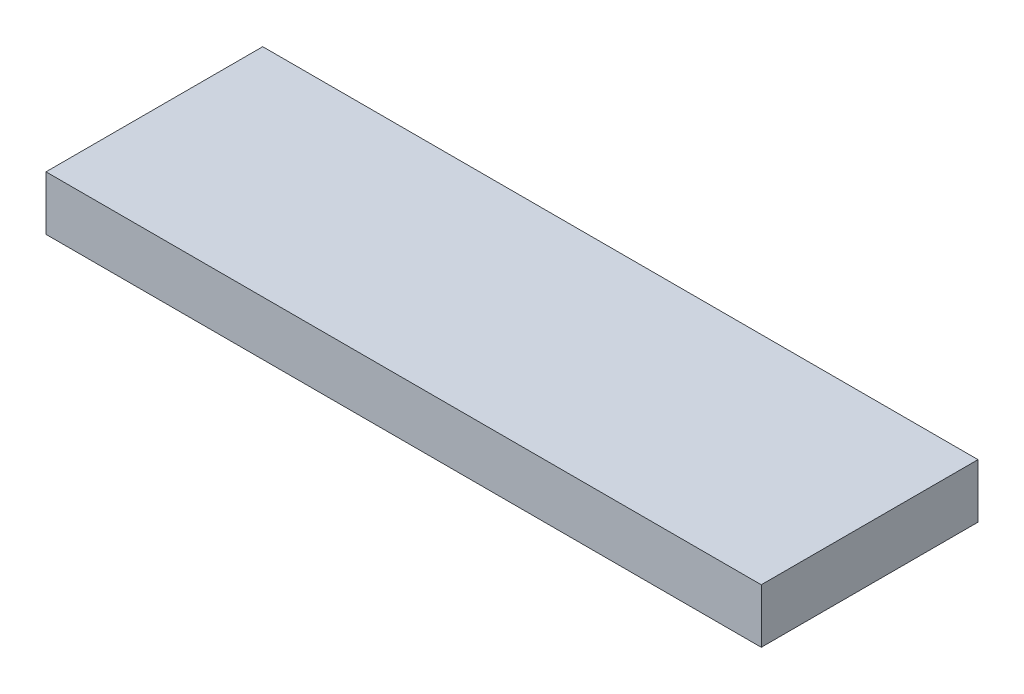
ISO-10303-21;
HEADER;
FILE_DESCRIPTION(('STEP AP214'),'2;1');
FILE_NAME('part.step','',(''),(''),'','','');
FILE_SCHEMA(('AUTOMOTIVE_DESIGN { 1 0 10303 214 1 1 1 1 }'));
ENDSEC;
DATA;
#1=APPLICATION_CONTEXT('core data for automotive mechanical design processes');
#2=APPLICATION_PROTOCOL_DEFINITION('international standard','automotive_design',2000,#1);
#3=PRODUCT_CONTEXT('',#1,'mechanical');
#4=PRODUCT('Part','Part','',(#3));
#5=PRODUCT_RELATED_PRODUCT_CATEGORY('part','',(#4));
#6=PRODUCT_DEFINITION_FORMATION('','',#4);
#7=PRODUCT_DEFINITION_CONTEXT('part definition',#1,'design');
#8=PRODUCT_DEFINITION('design','',#6,#7);
#9=PRODUCT_DEFINITION_SHAPE('','',#8);
#10=(LENGTH_UNIT() NAMED_UNIT(*) SI_UNIT(.MILLI.,.METRE.));
#11=(NAMED_UNIT(*) PLANE_ANGLE_UNIT() SI_UNIT($,.RADIAN.));
#12=(NAMED_UNIT(*) SI_UNIT($,.STERADIAN.) SOLID_ANGLE_UNIT());
#13=UNCERTAINTY_MEASURE_WITH_UNIT(LENGTH_MEASURE(1.E-05),#10,'distance_accuracy_value','');
#14=(GEOMETRIC_REPRESENTATION_CONTEXT(3) GLOBAL_UNCERTAINTY_ASSIGNED_CONTEXT((#13)) GLOBAL_UNIT_ASSIGNED_CONTEXT((#10,
#11,#12)) REPRESENTATION_CONTEXT('',''));
#15=CARTESIAN_POINT('',(0.,0.,0.));
#16=DIRECTION('',(0.,0.,1.));
#17=DIRECTION('',(1.,0.,0.));
#18=AXIS2_PLACEMENT_3D('',#15,#16,#17);
#19=CARTESIAN_POINT('',(0.,0.,0.));
#20=DIRECTION('',(0.,1.,0.));
#21=DIRECTION('',(0.,0.,1.));
#22=AXIS2_PLACEMENT_3D('',#19,#20,#21);
#23=PLANE('',#22);
#24=CARTESIAN_POINT('',(13.3548728060282,0.,0.));
#25=DIRECTION('',(0.,1.,0.));
#26=DIRECTION('',(0.,0.,-1.));
#27=AXIS2_PLACEMENT_3D('',#24,#25,#26);
#28=CIRCLE('',#27,5.08);
#29=CARTESIAN_POINT('',(13.3548728060282,0.,-5.08000000000009));
#30=VERTEX_POINT('',#29);
#31=CARTESIAN_POINT('',(13.3548728060283,0.,5.07999999999991));
#32=VERTEX_POINT('',#31);
#33=EDGE_CURVE('E66',#30,#32,#28,.T.);
#34=ORIENTED_EDGE('',*,*,#33,.T.);
#35=DIRECTION('',(1.,0.,0.));
#36=VECTOR('',#35,1.);
#37=CARTESIAN_POINT('',(13.3548728060283,0.,5.07999999999991));
#38=LINE('',#37,#36);
#39=CARTESIAN_POINT('',(20.9351271939718,0.,5.07999999999986));
#40=VERTEX_POINT('',#39);
#41=EDGE_CURVE('E180',#32,#40,#38,.T.);
#42=ORIENTED_EDGE('',*,*,#41,.T.);
#43=CARTESIAN_POINT('',(20.9351271939718,0.,-1.42796308022528E-13));
#44=DIRECTION('',(0.,1.,0.));
#45=DIRECTION('',(0.,0.,-1.));
#46=AXIS2_PLACEMENT_3D('',#43,#44,#45);
#47=CIRCLE('',#46,5.08);
#48=CARTESIAN_POINT('',(20.9351271939717,0.,-5.08000000000014));
#49=VERTEX_POINT('',#48);
#50=EDGE_CURVE('E176',#40,#49,#47,.T.);
#51=ORIENTED_EDGE('',*,*,#50,.T.);
#52=DIRECTION('',(-1.,0.,0.));
#53=VECTOR('',#52,1.);
#54=CARTESIAN_POINT('',(13.3548728060282,0.,-5.08000000000009));
#55=LINE('',#54,#53);
#56=EDGE_CURVE('E173',#49,#30,#55,.T.);
#57=ORIENTED_EDGE('',*,*,#56,.T.);
#58=EDGE_LOOP('',(#34,#42,#51,#57));
#59=FACE_BOUND('',#58,.T.);
#60=DIRECTION('',(0.,0.,1.));
#61=VECTOR('',#60,1.);
#62=CARTESIAN_POINT('',(-41.91,0.,12.7));
#63=LINE('',#62,#61);
#64=CARTESIAN_POINT('',(-41.91,0.,-12.7));
#65=VERTEX_POINT('',#64);
#66=CARTESIAN_POINT('',(-41.91,0.,12.7));
#67=VERTEX_POINT('',#66);
#68=EDGE_CURVE('E154',#65,#67,#63,.T.);
#69=ORIENTED_EDGE('',*,*,#68,.F.);
#70=DIRECTION('',(-1.,0.,0.));
#71=VECTOR('',#70,1.);
#72=CARTESIAN_POINT('',(41.91,0.,-12.7));
#73=LINE('',#72,#71);
#74=CARTESIAN_POINT('',(41.91,0.,-12.7));
#75=VERTEX_POINT('',#74);
#76=EDGE_CURVE('E195',#75,#65,#73,.T.);
#77=ORIENTED_EDGE('',*,*,#76,.F.);
#78=DIRECTION('',(0.,0.,-1.));
#79=VECTOR('',#78,1.);
#80=CARTESIAN_POINT('',(41.91,0.,12.7));
#81=LINE('',#80,#79);
#82=CARTESIAN_POINT('',(41.91,0.,12.7));
#83=VERTEX_POINT('',#82);
#84=EDGE_CURVE('E203',#83,#75,#81,.T.);
#85=ORIENTED_EDGE('',*,*,#84,.F.);
#86=DIRECTION('',(1.,0.,0.));
#87=VECTOR('',#86,1.);
#88=CARTESIAN_POINT('',(41.91,0.,12.7));
#89=LINE('',#88,#87);
#90=EDGE_CURVE('E158',#67,#83,#89,.T.);
#91=ORIENTED_EDGE('',*,*,#90,.F.);
#92=EDGE_LOOP('',(#69,#77,#85,#91));
#93=FACE_BOUND('',#92,.T.);
#94=CARTESIAN_POINT('',(-13.3548728060282,0.,0.));
#95=DIRECTION('',(0.,1.,0.));
#96=DIRECTION('',(0.,0.,1.));
#97=AXIS2_PLACEMENT_3D('',#94,#95,#96);
#98=CIRCLE('',#97,5.08);
#99=CARTESIAN_POINT('',(-13.3548728060282,0.,5.08));
#100=VERTEX_POINT('',#99);
#101=CARTESIAN_POINT('',(-13.3548728060282,0.,-5.08));
#102=VERTEX_POINT('',#101);
#103=EDGE_CURVE('E58',#100,#102,#98,.T.);
#104=ORIENTED_EDGE('',*,*,#103,.T.);
#105=DIRECTION('',(-1.,0.,0.));
#106=VECTOR('',#105,1.);
#107=CARTESIAN_POINT('',(-13.3548728060282,0.,-5.08));
#108=LINE('',#107,#106);
#109=CARTESIAN_POINT('',(-20.9351271939718,0.,-5.08));
#110=VERTEX_POINT('',#109);
#111=EDGE_CURVE('E153',#102,#110,#108,.T.);
#112=ORIENTED_EDGE('',*,*,#111,.T.);
#113=CARTESIAN_POINT('',(-20.9351271939718,0.,0.));
#114=DIRECTION('',(0.,1.,0.));
#115=DIRECTION('',(0.,0.,1.));
#116=AXIS2_PLACEMENT_3D('',#113,#114,#115);
#117=CIRCLE('',#116,5.08);
#118=CARTESIAN_POINT('',(-20.9351271939718,0.,5.08));
#119=VERTEX_POINT('',#118);
#120=EDGE_CURVE('E384',#110,#119,#117,.T.);
#121=ORIENTED_EDGE('',*,*,#120,.T.);
#122=DIRECTION('',(1.,0.,0.));
#123=VECTOR('',#122,1.);
#124=CARTESIAN_POINT('',(-13.3548728060282,0.,5.08));
#125=LINE('',#124,#123);
#126=EDGE_CURVE('E149',#119,#100,#125,.T.);
#127=ORIENTED_EDGE('',*,*,#126,.T.);
#128=EDGE_LOOP('',(#104,#112,#121,#127));
#129=FACE_BOUND('',#128,.T.);
#130=ADVANCED_FACE('F43',(#59,#93,#129),#23,.F.);
#131=CARTESIAN_POINT('',(-41.91,6.35,12.7));
#132=DIRECTION('',(1.,0.,0.));
#133=DIRECTION('',(0.,0.,-1.));
#134=AXIS2_PLACEMENT_3D('',#131,#132,#133);
#135=PLANE('',#134);
#136=ORIENTED_EDGE('',*,*,#68,.T.);
#137=DIRECTION('',(0.,-1.,0.));
#138=VECTOR('',#137,1.);
#139=CARTESIAN_POINT('',(-41.91,6.35,12.7));
#140=LINE('',#139,#138);
#141=CARTESIAN_POINT('',(-41.91,6.35,12.7));
#142=VERTEX_POINT('',#141);
#143=EDGE_CURVE('E11',#142,#67,#140,.T.);
#144=ORIENTED_EDGE('',*,*,#143,.F.);
#145=DIRECTION('',(0.,0.,1.));
#146=VECTOR('',#145,1.);
#147=CARTESIAN_POINT('',(-41.91,6.35,12.7));
#148=LINE('',#147,#146);
#149=CARTESIAN_POINT('',(-41.91,6.35,-12.7));
#150=VERTEX_POINT('',#149);
#151=EDGE_CURVE('E191',#150,#142,#148,.T.);
#152=ORIENTED_EDGE('',*,*,#151,.F.);
#153=DIRECTION('',(0.,-1.,0.));
#154=VECTOR('',#153,1.);
#155=CARTESIAN_POINT('',(-41.91,6.35,-12.7));
#156=LINE('',#155,#154);
#157=EDGE_CURVE('E200',#150,#65,#156,.T.);
#158=ORIENTED_EDGE('',*,*,#157,.T.);
#159=EDGE_LOOP('',(#136,#144,#152,#158));
#160=FACE_BOUND('',#159,.T.);
#161=ADVANCED_FACE('F45',(#160),#135,.F.);
#162=CARTESIAN_POINT('',(41.91,6.35,12.7));
#163=DIRECTION('',(0.,0.,-1.));
#164=DIRECTION('',(-1.,0.,0.));
#165=AXIS2_PLACEMENT_3D('',#162,#163,#164);
#166=PLANE('',#165);
#167=ORIENTED_EDGE('',*,*,#90,.T.);
#168=DIRECTION('',(0.,-1.,0.));
#169=VECTOR('',#168,1.);
#170=CARTESIAN_POINT('',(41.91,6.35,12.7));
#171=LINE('',#170,#169);
#172=CARTESIAN_POINT('',(41.91,6.35,12.7));
#173=VERTEX_POINT('',#172);
#174=EDGE_CURVE('E51',#173,#83,#171,.T.);
#175=ORIENTED_EDGE('',*,*,#174,.F.);
#176=DIRECTION('',(1.,0.,0.));
#177=VECTOR('',#176,1.);
#178=CARTESIAN_POINT('',(41.91,6.35,12.7));
#179=LINE('',#178,#177);
#180=EDGE_CURVE('E194',#142,#173,#179,.T.);
#181=ORIENTED_EDGE('',*,*,#180,.F.);
#182=ORIENTED_EDGE('',*,*,#143,.T.);
#183=EDGE_LOOP('',(#167,#175,#181,#182));
#184=FACE_BOUND('',#183,.T.);
#185=ADVANCED_FACE('F231',(#184),#166,.F.);
#186=CARTESIAN_POINT('',(41.91,6.35,12.7));
#187=DIRECTION('',(-1.,0.,0.));
#188=DIRECTION('',(0.,0.,1.));
#189=AXIS2_PLACEMENT_3D('',#186,#187,#188);
#190=PLANE('',#189);
#191=ORIENTED_EDGE('',*,*,#84,.T.);
#192=DIRECTION('',(0.,-1.,0.));
#193=VECTOR('',#192,1.);
#194=CARTESIAN_POINT('',(41.91,6.35,-12.7));
#195=LINE('',#194,#193);
#196=CARTESIAN_POINT('',(41.91,6.35,-12.7));
#197=VERTEX_POINT('',#196);
#198=EDGE_CURVE('E208',#197,#75,#195,.T.);
#199=ORIENTED_EDGE('',*,*,#198,.F.);
#200=DIRECTION('',(0.,0.,-1.));
#201=VECTOR('',#200,1.);
#202=CARTESIAN_POINT('',(41.91,6.35,12.7));
#203=LINE('',#202,#201);
#204=EDGE_CURVE('E197',#173,#197,#203,.T.);
#205=ORIENTED_EDGE('',*,*,#204,.F.);
#206=ORIENTED_EDGE('',*,*,#174,.T.);
#207=EDGE_LOOP('',(#191,#199,#205,#206));
#208=FACE_BOUND('',#207,.T.);
#209=ADVANCED_FACE('F215',(#208),#190,.F.);
#210=CARTESIAN_POINT('',(41.91,6.35,-12.7));
#211=DIRECTION('',(0.,0.,1.));
#212=DIRECTION('',(1.,0.,0.));
#213=AXIS2_PLACEMENT_3D('',#210,#211,#212);
#214=PLANE('',#213);
#215=ORIENTED_EDGE('',*,*,#76,.T.);
#216=ORIENTED_EDGE('',*,*,#157,.F.);
#217=DIRECTION('',(-1.,0.,0.));
#218=VECTOR('',#217,1.);
#219=CARTESIAN_POINT('',(41.91,6.35,-12.7));
#220=LINE('',#219,#218);
#221=EDGE_CURVE('E199',#197,#150,#220,.T.);
#222=ORIENTED_EDGE('',*,*,#221,.F.);
#223=ORIENTED_EDGE('',*,*,#198,.T.);
#224=EDGE_LOOP('',(#215,#216,#222,#223));
#225=FACE_BOUND('',#224,.T.);
#226=ADVANCED_FACE('F224',(#225),#214,.F.);
#227=CARTESIAN_POINT('',(0.,6.35,0.));
#228=DIRECTION('',(0.,1.,0.));
#229=DIRECTION('',(0.,0.,1.));
#230=AXIS2_PLACEMENT_3D('',#227,#228,#229);
#231=PLANE('',#230);
#232=ORIENTED_EDGE('',*,*,#151,.T.);
#233=ORIENTED_EDGE('',*,*,#180,.T.);
#234=ORIENTED_EDGE('',*,*,#204,.T.);
#235=ORIENTED_EDGE('',*,*,#221,.T.);
#236=EDGE_LOOP('',(#232,#233,#234,#235));
#237=FACE_BOUND('',#236,.T.);
#238=ADVANCED_FACE('F230',(#237),#231,.T.);
#239=CARTESIAN_POINT('',(13.3548728060282,3.175,0.));
#240=DIRECTION('',(0.,-1.,0.));
#241=DIRECTION('',(0.,0.,-1.));
#242=AXIS2_PLACEMENT_3D('',#239,#240,#241);
#243=CYLINDRICAL_SURFACE('',#242,5.08);
#244=ORIENTED_EDGE('',*,*,#33,.F.);
#245=DIRECTION('',(0.,-1.,0.));
#246=VECTOR('',#245,1.);
#247=CARTESIAN_POINT('',(13.3548728060282,3.175,-5.08000000000009));
#248=LINE('',#247,#246);
#249=CARTESIAN_POINT('',(13.3548728060282,3.175,-5.08000000000009));
#250=VERTEX_POINT('',#249);
#251=EDGE_CURVE('E170',#250,#30,#248,.T.);
#252=ORIENTED_EDGE('',*,*,#251,.F.);
#253=CARTESIAN_POINT('',(13.3548728060282,3.175,0.));
#254=DIRECTION('',(0.,1.,0.));
#255=DIRECTION('',(0.,0.,-1.));
#256=AXIS2_PLACEMENT_3D('',#253,#254,#255);
#257=CIRCLE('',#256,5.08);
#258=CARTESIAN_POINT('',(13.3548728060283,3.175,5.07999999999991));
#259=VERTEX_POINT('',#258);
#260=EDGE_CURVE('E177',#250,#259,#257,.T.);
#261=ORIENTED_EDGE('',*,*,#260,.T.);
#262=DIRECTION('',(0.,-1.,0.));
#263=VECTOR('',#262,1.);
#264=CARTESIAN_POINT('',(13.3548728060283,3.175,5.07999999999991));
#265=LINE('',#264,#263);
#266=EDGE_CURVE('E164',#259,#32,#265,.T.);
#267=ORIENTED_EDGE('',*,*,#266,.T.);
#268=EDGE_LOOP('',(#244,#252,#261,#267));
#269=FACE_BOUND('',#268,.T.);
#270=ADVANCED_FACE('F251',(#269),#243,.F.);
#271=CARTESIAN_POINT('',(13.3548728060283,3.175,5.07999999999991));
#272=DIRECTION('',(0.,0.,-1.));
#273=DIRECTION('',(-1.,0.,0.));
#274=AXIS2_PLACEMENT_3D('',#271,#272,#273);
#275=PLANE('',#274);
#276=ORIENTED_EDGE('',*,*,#41,.F.);
#277=ORIENTED_EDGE('',*,*,#266,.F.);
#278=DIRECTION('',(1.,0.,0.));
#279=VECTOR('',#278,1.);
#280=CARTESIAN_POINT('',(13.3548728060283,3.175,5.07999999999991));
#281=LINE('',#280,#279);
#282=CARTESIAN_POINT('',(20.9351271939718,3.175,5.07999999999986));
#283=VERTEX_POINT('',#282);
#284=EDGE_CURVE('E187',#259,#283,#281,.T.);
#285=ORIENTED_EDGE('',*,*,#284,.T.);
#286=DIRECTION('',(0.,-1.,0.));
#287=VECTOR('',#286,1.);
#288=CARTESIAN_POINT('',(20.9351271939718,3.175,5.07999999999986));
#289=LINE('',#288,#287);
#290=EDGE_CURVE('E166',#283,#40,#289,.T.);
#291=ORIENTED_EDGE('',*,*,#290,.T.);
#292=EDGE_LOOP('',(#276,#277,#285,#291));
#293=FACE_BOUND('',#292,.T.);
#294=ADVANCED_FACE('F254',(#293),#275,.T.);
#295=CARTESIAN_POINT('',(20.9351271939718,3.175,-1.42796308022528E-13));
#296=DIRECTION('',(0.,-1.,0.));
#297=DIRECTION('',(0.,0.,-1.));
#298=AXIS2_PLACEMENT_3D('',#295,#296,#297);
#299=CYLINDRICAL_SURFACE('',#298,5.08);
#300=ORIENTED_EDGE('',*,*,#50,.F.);
#301=ORIENTED_EDGE('',*,*,#290,.F.);
#302=CARTESIAN_POINT('',(20.9351271939718,3.175,-1.42796308022528E-13));
#303=DIRECTION('',(0.,1.,0.));
#304=DIRECTION('',(0.,0.,-1.));
#305=AXIS2_PLACEMENT_3D('',#302,#303,#304);
#306=CIRCLE('',#305,5.08);
#307=CARTESIAN_POINT('',(20.9351271939717,3.175,-5.08000000000014));
#308=VERTEX_POINT('',#307);
#309=EDGE_CURVE('E185',#283,#308,#306,.T.);
#310=ORIENTED_EDGE('',*,*,#309,.T.);
#311=DIRECTION('',(0.,-1.,0.));
#312=VECTOR('',#311,1.);
#313=CARTESIAN_POINT('',(20.9351271939717,3.175,-5.08000000000014));
#314=LINE('',#313,#312);
#315=EDGE_CURVE('E168',#308,#49,#314,.T.);
#316=ORIENTED_EDGE('',*,*,#315,.T.);
#317=EDGE_LOOP('',(#300,#301,#310,#316));
#318=FACE_BOUND('',#317,.T.);
#319=ADVANCED_FACE('F259',(#318),#299,.F.);
#320=CARTESIAN_POINT('',(13.3548728060282,3.175,-5.08000000000009));
#321=DIRECTION('',(0.,0.,1.));
#322=DIRECTION('',(1.,0.,0.));
#323=AXIS2_PLACEMENT_3D('',#320,#321,#322);
#324=PLANE('',#323);
#325=ORIENTED_EDGE('',*,*,#56,.F.);
#326=ORIENTED_EDGE('',*,*,#315,.F.);
#327=DIRECTION('',(-1.,0.,0.));
#328=VECTOR('',#327,1.);
#329=CARTESIAN_POINT('',(13.3548728060282,3.175,-5.08000000000009));
#330=LINE('',#329,#328);
#331=EDGE_CURVE('E172',#308,#250,#330,.T.);
#332=ORIENTED_EDGE('',*,*,#331,.T.);
#333=ORIENTED_EDGE('',*,*,#251,.T.);
#334=EDGE_LOOP('',(#325,#326,#332,#333));
#335=FACE_BOUND('',#334,.T.);
#336=ADVANCED_FACE('F267',(#335),#324,.T.);
#337=CARTESIAN_POINT('',(13.3548728060282,3.175,0.));
#338=DIRECTION('',(0.,-1.,0.));
#339=DIRECTION('',(0.,0.,-1.));
#340=AXIS2_PLACEMENT_3D('',#337,#338,#339);
#341=PLANE('',#340);
#342=ORIENTED_EDGE('',*,*,#260,.F.);
#343=ORIENTED_EDGE('',*,*,#331,.F.);
#344=ORIENTED_EDGE('',*,*,#309,.F.);
#345=ORIENTED_EDGE('',*,*,#284,.F.);
#346=EDGE_LOOP('',(#342,#343,#344,#345));
#347=FACE_BOUND('',#346,.T.);
#348=ADVANCED_FACE('F270',(#347),#341,.T.);
#349=CARTESIAN_POINT('',(-13.3548728060282,3.175,0.));
#350=DIRECTION('',(0.,-1.,0.));
#351=DIRECTION('',(0.,0.,-1.));
#352=AXIS2_PLACEMENT_3D('',#349,#350,#351);
#353=CYLINDRICAL_SURFACE('',#352,5.08);
#354=ORIENTED_EDGE('',*,*,#103,.F.);
#355=DIRECTION('',(0.,-1.,0.));
#356=VECTOR('',#355,1.);
#357=CARTESIAN_POINT('',(-13.3548728060282,3.175,5.08));
#358=LINE('',#357,#356);
#359=CARTESIAN_POINT('',(-13.3548728060282,3.175,5.08));
#360=VERTEX_POINT('',#359);
#361=EDGE_CURVE('E148',#360,#100,#358,.T.);
#362=ORIENTED_EDGE('',*,*,#361,.F.);
#363=CARTESIAN_POINT('',(-13.3548728060282,3.175,0.));
#364=DIRECTION('',(0.,1.,0.));
#365=DIRECTION('',(0.,0.,1.));
#366=AXIS2_PLACEMENT_3D('',#363,#364,#365);
#367=CIRCLE('',#366,5.08);
#368=CARTESIAN_POINT('',(-13.3548728060282,3.175,-5.08));
#369=VERTEX_POINT('',#368);
#370=EDGE_CURVE('E140',#360,#369,#367,.T.);
#371=ORIENTED_EDGE('',*,*,#370,.T.);
#372=DIRECTION('',(0.,-1.,0.));
#373=VECTOR('',#372,1.);
#374=CARTESIAN_POINT('',(-13.3548728060282,3.175,-5.08));
#375=LINE('',#374,#373);
#376=EDGE_CURVE('E147',#369,#102,#375,.T.);
#377=ORIENTED_EDGE('',*,*,#376,.T.);
#378=EDGE_LOOP('',(#354,#362,#371,#377));
#379=FACE_BOUND('',#378,.T.);
#380=ADVANCED_FACE('F146',(#379),#353,.F.);
#381=CARTESIAN_POINT('',(-13.3548728060282,3.175,-5.08));
#382=DIRECTION('',(0.,0.,1.));
#383=DIRECTION('',(1.,0.,0.));
#384=AXIS2_PLACEMENT_3D('',#381,#382,#383);
#385=PLANE('',#384);
#386=ORIENTED_EDGE('',*,*,#111,.F.);
#387=ORIENTED_EDGE('',*,*,#376,.F.);
#388=DIRECTION('',(-1.,0.,0.));
#389=VECTOR('',#388,1.);
#390=CARTESIAN_POINT('',(-13.3548728060282,3.175,-5.08));
#391=LINE('',#390,#389);
#392=CARTESIAN_POINT('',(-20.9351271939718,3.175,-5.08));
#393=VERTEX_POINT('',#392);
#394=EDGE_CURVE('E136',#369,#393,#391,.T.);
#395=ORIENTED_EDGE('',*,*,#394,.T.);
#396=DIRECTION('',(0.,-1.,0.));
#397=VECTOR('',#396,1.);
#398=CARTESIAN_POINT('',(-20.9351271939718,3.175,-5.08));
#399=LINE('',#398,#397);
#400=EDGE_CURVE('E155',#393,#110,#399,.T.);
#401=ORIENTED_EDGE('',*,*,#400,.T.);
#402=EDGE_LOOP('',(#386,#387,#395,#401));
#403=FACE_BOUND('',#402,.T.);
#404=ADVANCED_FACE('F151',(#403),#385,.T.);
#405=CARTESIAN_POINT('',(-20.9351271939718,3.175,0.));
#406=DIRECTION('',(0.,-1.,0.));
#407=DIRECTION('',(0.,0.,-1.));
#408=AXIS2_PLACEMENT_3D('',#405,#406,#407);
#409=CYLINDRICAL_SURFACE('',#408,5.08);
#410=ORIENTED_EDGE('',*,*,#120,.F.);
#411=ORIENTED_EDGE('',*,*,#400,.F.);
#412=CARTESIAN_POINT('',(-20.9351271939718,3.175,0.));
#413=DIRECTION('',(0.,1.,0.));
#414=DIRECTION('',(0.,0.,1.));
#415=AXIS2_PLACEMENT_3D('',#412,#413,#414);
#416=CIRCLE('',#415,5.08);
#417=CARTESIAN_POINT('',(-20.9351271939718,3.175,5.08));
#418=VERTEX_POINT('',#417);
#419=EDGE_CURVE('E141',#393,#418,#416,.T.);
#420=ORIENTED_EDGE('',*,*,#419,.T.);
#421=DIRECTION('',(0.,-1.,0.));
#422=VECTOR('',#421,1.);
#423=CARTESIAN_POINT('',(-20.9351271939718,3.175,5.08));
#424=LINE('',#423,#422);
#425=EDGE_CURVE('E160',#418,#119,#424,.T.);
#426=ORIENTED_EDGE('',*,*,#425,.T.);
#427=EDGE_LOOP('',(#410,#411,#420,#426));
#428=FACE_BOUND('',#427,.T.);
#429=ADVANCED_FACE('F288',(#428),#409,.F.);
#430=CARTESIAN_POINT('',(-13.3548728060282,3.175,5.08));
#431=DIRECTION('',(0.,0.,-1.));
#432=DIRECTION('',(-1.,0.,0.));
#433=AXIS2_PLACEMENT_3D('',#430,#431,#432);
#434=PLANE('',#433);
#435=ORIENTED_EDGE('',*,*,#126,.F.);
#436=ORIENTED_EDGE('',*,*,#425,.F.);
#437=DIRECTION('',(1.,0.,0.));
#438=VECTOR('',#437,1.);
#439=CARTESIAN_POINT('',(-13.3548728060282,3.175,5.08));
#440=LINE('',#439,#438);
#441=EDGE_CURVE('E391',#418,#360,#440,.T.);
#442=ORIENTED_EDGE('',*,*,#441,.T.);
#443=ORIENTED_EDGE('',*,*,#361,.T.);
#444=EDGE_LOOP('',(#435,#436,#442,#443));
#445=FACE_BOUND('',#444,.T.);
#446=ADVANCED_FACE('F292',(#445),#434,.T.);
#447=CARTESIAN_POINT('',(-13.3548728060282,3.175,0.));
#448=DIRECTION('',(0.,1.,0.));
#449=DIRECTION('',(0.,0.,1.));
#450=AXIS2_PLACEMENT_3D('',#447,#448,#449);
#451=PLANE('',#450);
#452=ORIENTED_EDGE('',*,*,#370,.F.);
#453=ORIENTED_EDGE('',*,*,#441,.F.);
#454=ORIENTED_EDGE('',*,*,#419,.F.);
#455=ORIENTED_EDGE('',*,*,#394,.F.);
#456=EDGE_LOOP('',(#452,#453,#454,#455));
#457=FACE_BOUND('',#456,.T.);
#458=ADVANCED_FACE('F138',(#457),#451,.F.);
#459=CLOSED_SHELL('',(#130,#161,#185,#209,#226,#238,#270,#294,#319,#336,#348,#380,#404,#429,
#446,#458));
#460=MANIFOLD_SOLID_BREP('B2',#459);
#461=ADVANCED_BREP_SHAPE_REPRESENTATION('',(#18,#460),#14);
#462=SHAPE_DEFINITION_REPRESENTATION(#9,#461);
ENDSEC;
END-ISO-10303-21;
